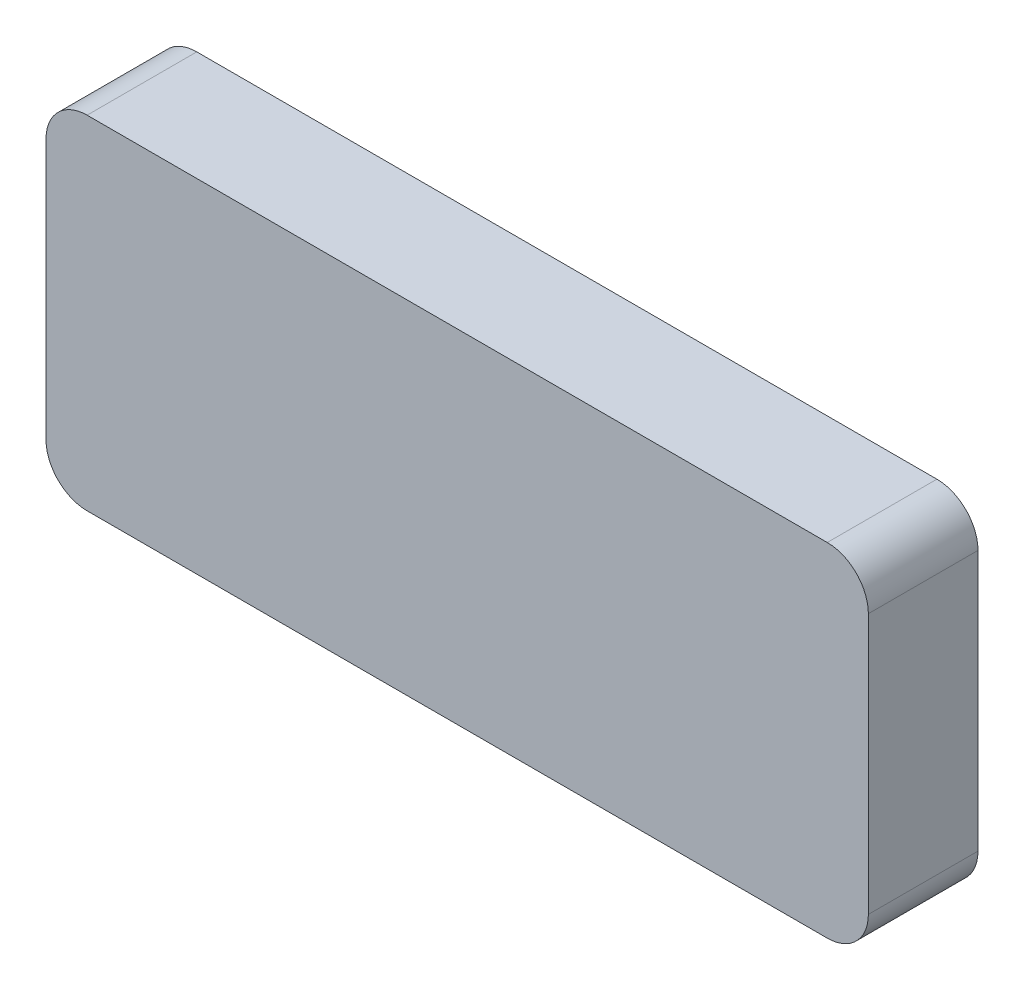
ISO-10303-21;
HEADER;
FILE_DESCRIPTION(('STEP AP214'),'2;1');
FILE_NAME('part.step','',(''),(''),'','','');
FILE_SCHEMA(('AUTOMOTIVE_DESIGN { 1 0 10303 214 1 1 1 1 }'));
ENDSEC;
DATA;
#1=APPLICATION_CONTEXT('core data for automotive mechanical design processes');
#2=APPLICATION_PROTOCOL_DEFINITION('international standard','automotive_design',2000,#1);
#3=PRODUCT_CONTEXT('',#1,'mechanical');
#4=PRODUCT('Part','Part','',(#3));
#5=PRODUCT_RELATED_PRODUCT_CATEGORY('part','',(#4));
#6=PRODUCT_DEFINITION_FORMATION('','',#4);
#7=PRODUCT_DEFINITION_CONTEXT('part definition',#1,'design');
#8=PRODUCT_DEFINITION('design','',#6,#7);
#9=PRODUCT_DEFINITION_SHAPE('','',#8);
#10=(LENGTH_UNIT() NAMED_UNIT(*) SI_UNIT(.MILLI.,.METRE.));
#11=(NAMED_UNIT(*) PLANE_ANGLE_UNIT() SI_UNIT($,.RADIAN.));
#12=(NAMED_UNIT(*) SI_UNIT($,.STERADIAN.) SOLID_ANGLE_UNIT());
#13=UNCERTAINTY_MEASURE_WITH_UNIT(LENGTH_MEASURE(1.E-05),#10,'distance_accuracy_value','');
#14=(GEOMETRIC_REPRESENTATION_CONTEXT(3) GLOBAL_UNCERTAINTY_ASSIGNED_CONTEXT((#13)) GLOBAL_UNIT_ASSIGNED_CONTEXT((#10,
#11,#12)) REPRESENTATION_CONTEXT('',''));
#15=CARTESIAN_POINT('',(0.,0.,0.));
#16=DIRECTION('',(0.,0.,1.));
#17=DIRECTION('',(1.,0.,0.));
#18=AXIS2_PLACEMENT_3D('',#15,#16,#17);
#19=CARTESIAN_POINT('',(30.,12.5,-8.));
#20=DIRECTION('',(1.,0.,0.));
#21=DIRECTION('',(0.,0.,-1.));
#22=AXIS2_PLACEMENT_3D('',#19,#20,#21);
#23=PLANE('',#22);
#24=DIRECTION('',(0.,1.,0.));
#25=VECTOR('',#24,1.);
#26=CARTESIAN_POINT('',(30.,12.5,-8.));
#27=LINE('',#26,#25);
#28=CARTESIAN_POINT('',(30.,-9.5,-8.));
#29=VERTEX_POINT('',#28);
#30=CARTESIAN_POINT('',(30.,9.5,-8.));
#31=VERTEX_POINT('',#30);
#32=EDGE_CURVE('E166',#29,#31,#27,.T.);
#33=ORIENTED_EDGE('',*,*,#32,.T.);
#34=DIRECTION('',(0.,0.,1.));
#35=VECTOR('',#34,1.);
#36=CARTESIAN_POINT('',(30.,9.5,-8.));
#37=LINE('',#36,#35);
#38=CARTESIAN_POINT('',(30.,9.5,0.));
#39=VERTEX_POINT('',#38);
#40=EDGE_CURVE('E121',#31,#39,#37,.T.);
#41=ORIENTED_EDGE('',*,*,#40,.T.);
#42=DIRECTION('',(0.,1.,0.));
#43=VECTOR('',#42,1.);
#44=CARTESIAN_POINT('',(30.,12.5,0.));
#45=LINE('',#44,#43);
#46=CARTESIAN_POINT('',(30.,-9.5,0.));
#47=VERTEX_POINT('',#46);
#48=EDGE_CURVE('E105',#47,#39,#45,.T.);
#49=ORIENTED_EDGE('',*,*,#48,.F.);
#50=DIRECTION('',(0.,0.,1.));
#51=VECTOR('',#50,1.);
#52=CARTESIAN_POINT('',(30.,-9.5,-8.));
#53=LINE('',#52,#51);
#54=EDGE_CURVE('E118',#47,#29,#53,.F.);
#55=ORIENTED_EDGE('',*,*,#54,.T.);
#56=EDGE_LOOP('',(#33,#41,#49,#55));
#57=FACE_BOUND('',#56,.T.);
#58=ADVANCED_FACE('F36',(#57),#23,.T.);
#59=CARTESIAN_POINT('',(-30.,-12.5,-8.));
#60=DIRECTION('',(0.,-1.,0.));
#61=DIRECTION('',(0.,0.,-1.));
#62=AXIS2_PLACEMENT_3D('',#59,#60,#61);
#63=PLANE('',#62);
#64=DIRECTION('',(1.,0.,0.));
#65=VECTOR('',#64,1.);
#66=CARTESIAN_POINT('',(-30.,-12.5,-8.));
#67=LINE('',#66,#65);
#68=CARTESIAN_POINT('',(-27.,-12.5,-8.));
#69=VERTEX_POINT('',#68);
#70=CARTESIAN_POINT('',(27.,-12.5,-8.));
#71=VERTEX_POINT('',#70);
#72=EDGE_CURVE('E127',#69,#71,#67,.T.);
#73=ORIENTED_EDGE('',*,*,#72,.T.);
#74=DIRECTION('',(0.,0.,1.));
#75=VECTOR('',#74,1.);
#76=CARTESIAN_POINT('',(27.,-12.5,-8.));
#77=LINE('',#76,#75);
#78=CARTESIAN_POINT('',(27.,-12.5,0.));
#79=VERTEX_POINT('',#78);
#80=EDGE_CURVE('E153',#71,#79,#77,.T.);
#81=ORIENTED_EDGE('',*,*,#80,.T.);
#82=DIRECTION('',(1.,0.,0.));
#83=VECTOR('',#82,1.);
#84=CARTESIAN_POINT('',(-30.,-12.5,0.));
#85=LINE('',#84,#83);
#86=CARTESIAN_POINT('',(-27.,-12.5,0.));
#87=VERTEX_POINT('',#86);
#88=EDGE_CURVE('E107',#87,#79,#85,.T.);
#89=ORIENTED_EDGE('',*,*,#88,.F.);
#90=DIRECTION('',(0.,0.,1.));
#91=VECTOR('',#90,1.);
#92=CARTESIAN_POINT('',(-27.,-12.5,-8.));
#93=LINE('',#92,#91);
#94=EDGE_CURVE('E151',#87,#69,#93,.F.);
#95=ORIENTED_EDGE('',*,*,#94,.T.);
#96=EDGE_LOOP('',(#73,#81,#89,#95));
#97=FACE_BOUND('',#96,.T.);
#98=ADVANCED_FACE('F155',(#97),#63,.T.);
#99=CARTESIAN_POINT('',(-30.,12.5,-8.));
#100=DIRECTION('',(-1.,0.,0.));
#101=DIRECTION('',(0.,-1.,0.));
#102=AXIS2_PLACEMENT_3D('',#99,#100,#101);
#103=PLANE('',#102);
#104=DIRECTION('',(0.,-1.,0.));
#105=VECTOR('',#104,1.);
#106=CARTESIAN_POINT('',(-30.,12.5,-8.));
#107=LINE('',#106,#105);
#108=CARTESIAN_POINT('',(-30.,9.5,-8.));
#109=VERTEX_POINT('',#108);
#110=CARTESIAN_POINT('',(-30.,-9.5,-8.));
#111=VERTEX_POINT('',#110);
#112=EDGE_CURVE('E132',#109,#111,#107,.T.);
#113=ORIENTED_EDGE('',*,*,#112,.T.);
#114=DIRECTION('',(0.,0.,1.));
#115=VECTOR('',#114,1.);
#116=CARTESIAN_POINT('',(-30.,-9.5,-8.));
#117=LINE('',#116,#115);
#118=CARTESIAN_POINT('',(-30.,-9.5,0.));
#119=VERTEX_POINT('',#118);
#120=EDGE_CURVE('E11',#111,#119,#117,.T.);
#121=ORIENTED_EDGE('',*,*,#120,.T.);
#122=DIRECTION('',(0.,-1.,0.));
#123=VECTOR('',#122,1.);
#124=CARTESIAN_POINT('',(-30.,12.5,0.));
#125=LINE('',#124,#123);
#126=CARTESIAN_POINT('',(-30.,9.5,0.));
#127=VERTEX_POINT('',#126);
#128=EDGE_CURVE('E164',#127,#119,#125,.T.);
#129=ORIENTED_EDGE('',*,*,#128,.F.);
#130=DIRECTION('',(0.,0.,1.));
#131=VECTOR('',#130,1.);
#132=CARTESIAN_POINT('',(-30.,9.5,-8.));
#133=LINE('',#132,#131);
#134=EDGE_CURVE('E44',#127,#109,#133,.F.);
#135=ORIENTED_EDGE('',*,*,#134,.T.);
#136=EDGE_LOOP('',(#113,#121,#129,#135));
#137=FACE_BOUND('',#136,.T.);
#138=ADVANCED_FACE('F163',(#137),#103,.T.);
#139=CARTESIAN_POINT('',(-30.,12.5,-8.));
#140=DIRECTION('',(0.,1.,0.));
#141=DIRECTION('',(0.,0.,1.));
#142=AXIS2_PLACEMENT_3D('',#139,#140,#141);
#143=PLANE('',#142);
#144=DIRECTION('',(-1.,0.,0.));
#145=VECTOR('',#144,1.);
#146=CARTESIAN_POINT('',(-30.,12.5,0.));
#147=LINE('',#146,#145);
#148=CARTESIAN_POINT('',(27.,12.5,0.));
#149=VERTEX_POINT('',#148);
#150=CARTESIAN_POINT('',(-27.,12.5,0.));
#151=VERTEX_POINT('',#150);
#152=EDGE_CURVE('E122',#149,#151,#147,.T.);
#153=ORIENTED_EDGE('',*,*,#152,.F.);
#154=DIRECTION('',(0.,0.,1.));
#155=VECTOR('',#154,1.);
#156=CARTESIAN_POINT('',(27.,12.5,-8.));
#157=LINE('',#156,#155);
#158=CARTESIAN_POINT('',(27.,12.5,-8.));
#159=VERTEX_POINT('',#158);
#160=EDGE_CURVE('E143',#149,#159,#157,.F.);
#161=ORIENTED_EDGE('',*,*,#160,.T.);
#162=DIRECTION('',(-1.,0.,0.));
#163=VECTOR('',#162,1.);
#164=CARTESIAN_POINT('',(-30.,12.5,-8.));
#165=LINE('',#164,#163);
#166=CARTESIAN_POINT('',(-27.,12.5,-8.));
#167=VERTEX_POINT('',#166);
#168=EDGE_CURVE('E170',#159,#167,#165,.T.);
#169=ORIENTED_EDGE('',*,*,#168,.T.);
#170=DIRECTION('',(0.,0.,1.));
#171=VECTOR('',#170,1.);
#172=CARTESIAN_POINT('',(-27.,12.5,-8.));
#173=LINE('',#172,#171);
#174=EDGE_CURVE('E140',#167,#151,#173,.T.);
#175=ORIENTED_EDGE('',*,*,#174,.T.);
#176=EDGE_LOOP('',(#153,#161,#169,#175));
#177=FACE_BOUND('',#176,.T.);
#178=ADVANCED_FACE('F179',(#177),#143,.T.);
#179=CARTESIAN_POINT('',(0.,0.,-8.));
#180=DIRECTION('',(0.,0.,1.));
#181=DIRECTION('',(1.,0.,0.));
#182=AXIS2_PLACEMENT_3D('',#179,#180,#181);
#183=PLANE('',#182);
#184=ORIENTED_EDGE('',*,*,#168,.F.);
#185=CARTESIAN_POINT('',(27.,9.5,-8.));
#186=DIRECTION('',(0.,0.,1.));
#187=DIRECTION('',(1.,0.,0.));
#188=AXIS2_PLACEMENT_3D('',#185,#186,#187);
#189=CIRCLE('',#188,3.);
#190=EDGE_CURVE('E149',#159,#31,#189,.F.);
#191=ORIENTED_EDGE('',*,*,#190,.T.);
#192=ORIENTED_EDGE('',*,*,#32,.F.);
#193=CARTESIAN_POINT('',(27.,-9.5,-8.));
#194=DIRECTION('',(0.,0.,1.));
#195=DIRECTION('',(1.,0.,0.));
#196=AXIS2_PLACEMENT_3D('',#193,#194,#195);
#197=CIRCLE('',#196,3.);
#198=EDGE_CURVE('E126',#29,#71,#197,.F.);
#199=ORIENTED_EDGE('',*,*,#198,.T.);
#200=ORIENTED_EDGE('',*,*,#72,.F.);
#201=CARTESIAN_POINT('',(-27.,-9.5,-8.));
#202=DIRECTION('',(0.,0.,1.));
#203=DIRECTION('',(1.,0.,0.));
#204=AXIS2_PLACEMENT_3D('',#201,#202,#203);
#205=CIRCLE('',#204,3.);
#206=EDGE_CURVE('E51',#69,#111,#205,.F.);
#207=ORIENTED_EDGE('',*,*,#206,.T.);
#208=ORIENTED_EDGE('',*,*,#112,.F.);
#209=CARTESIAN_POINT('',(-27.,9.5,-8.));
#210=DIRECTION('',(0.,0.,1.));
#211=DIRECTION('',(1.,0.,0.));
#212=AXIS2_PLACEMENT_3D('',#209,#210,#211);
#213=CIRCLE('',#212,3.);
#214=EDGE_CURVE('E145',#109,#167,#213,.F.);
#215=ORIENTED_EDGE('',*,*,#214,.T.);
#216=EDGE_LOOP('',(#184,#191,#192,#199,#200,#207,#208,#215));
#217=FACE_BOUND('',#216,.T.);
#218=ADVANCED_FACE('F158',(#217),#183,.F.);
#219=CARTESIAN_POINT('',(0.,0.,0.));
#220=DIRECTION('',(0.,0.,1.));
#221=DIRECTION('',(1.,0.,0.));
#222=AXIS2_PLACEMENT_3D('',#219,#220,#221);
#223=PLANE('',#222);
#224=ORIENTED_EDGE('',*,*,#48,.T.);
#225=CARTESIAN_POINT('',(27.,9.5,0.));
#226=DIRECTION('',(0.,0.,1.));
#227=DIRECTION('',(1.,0.,0.));
#228=AXIS2_PLACEMENT_3D('',#225,#226,#227);
#229=CIRCLE('',#228,3.);
#230=EDGE_CURVE('E112',#39,#149,#229,.T.);
#231=ORIENTED_EDGE('',*,*,#230,.T.);
#232=ORIENTED_EDGE('',*,*,#152,.T.);
#233=CARTESIAN_POINT('',(-27.,9.5,0.));
#234=DIRECTION('',(0.,0.,1.));
#235=DIRECTION('',(1.,0.,0.));
#236=AXIS2_PLACEMENT_3D('',#233,#234,#235);
#237=CIRCLE('',#236,3.);
#238=EDGE_CURVE('E129',#151,#127,#237,.T.);
#239=ORIENTED_EDGE('',*,*,#238,.T.);
#240=ORIENTED_EDGE('',*,*,#128,.T.);
#241=CARTESIAN_POINT('',(-27.,-9.5,0.));
#242=DIRECTION('',(0.,0.,1.));
#243=DIRECTION('',(1.,0.,0.));
#244=AXIS2_PLACEMENT_3D('',#241,#242,#243);
#245=CIRCLE('',#244,3.);
#246=EDGE_CURVE('E113',#119,#87,#245,.T.);
#247=ORIENTED_EDGE('',*,*,#246,.T.);
#248=ORIENTED_EDGE('',*,*,#88,.T.);
#249=CARTESIAN_POINT('',(27.,-9.5,0.));
#250=DIRECTION('',(0.,0.,1.));
#251=DIRECTION('',(1.,0.,0.));
#252=AXIS2_PLACEMENT_3D('',#249,#250,#251);
#253=CIRCLE('',#252,3.);
#254=EDGE_CURVE('E102',#79,#47,#253,.T.);
#255=ORIENTED_EDGE('',*,*,#254,.T.);
#256=EDGE_LOOP('',(#224,#231,#232,#239,#240,#247,#248,#255));
#257=FACE_BOUND('',#256,.T.);
#258=ADVANCED_FACE('F104',(#257),#223,.T.);
#259=CARTESIAN_POINT('',(27.,9.5,-8.));
#260=DIRECTION('',(0.,0.,1.));
#261=DIRECTION('',(1.,0.,0.));
#262=AXIS2_PLACEMENT_3D('',#259,#260,#261);
#263=CYLINDRICAL_SURFACE('',#262,3.);
#264=ORIENTED_EDGE('',*,*,#190,.F.);
#265=ORIENTED_EDGE('',*,*,#160,.F.);
#266=ORIENTED_EDGE('',*,*,#230,.F.);
#267=ORIENTED_EDGE('',*,*,#40,.F.);
#268=EDGE_LOOP('',(#264,#265,#266,#267));
#269=FACE_BOUND('',#268,.T.);
#270=ADVANCED_FACE('F175',(#269),#263,.T.);
#271=CARTESIAN_POINT('',(27.,-9.5,-8.));
#272=DIRECTION('',(0.,0.,1.));
#273=DIRECTION('',(1.,0.,0.));
#274=AXIS2_PLACEMENT_3D('',#271,#272,#273);
#275=CYLINDRICAL_SURFACE('',#274,3.);
#276=ORIENTED_EDGE('',*,*,#198,.F.);
#277=ORIENTED_EDGE('',*,*,#54,.F.);
#278=ORIENTED_EDGE('',*,*,#254,.F.);
#279=ORIENTED_EDGE('',*,*,#80,.F.);
#280=EDGE_LOOP('',(#276,#277,#278,#279));
#281=FACE_BOUND('',#280,.T.);
#282=ADVANCED_FACE('F125',(#281),#275,.T.);
#283=CARTESIAN_POINT('',(-27.,-9.5,-8.));
#284=DIRECTION('',(0.,0.,1.));
#285=DIRECTION('',(1.,0.,0.));
#286=AXIS2_PLACEMENT_3D('',#283,#284,#285);
#287=CYLINDRICAL_SURFACE('',#286,3.);
#288=ORIENTED_EDGE('',*,*,#206,.F.);
#289=ORIENTED_EDGE('',*,*,#94,.F.);
#290=ORIENTED_EDGE('',*,*,#246,.F.);
#291=ORIENTED_EDGE('',*,*,#120,.F.);
#292=EDGE_LOOP('',(#288,#289,#290,#291));
#293=FACE_BOUND('',#292,.T.);
#294=ADVANCED_FACE('F161',(#293),#287,.T.);
#295=CARTESIAN_POINT('',(-27.,9.5,-8.));
#296=DIRECTION('',(0.,0.,1.));
#297=DIRECTION('',(1.,0.,0.));
#298=AXIS2_PLACEMENT_3D('',#295,#296,#297);
#299=CYLINDRICAL_SURFACE('',#298,3.);
#300=ORIENTED_EDGE('',*,*,#214,.F.);
#301=ORIENTED_EDGE('',*,*,#134,.F.);
#302=ORIENTED_EDGE('',*,*,#238,.F.);
#303=ORIENTED_EDGE('',*,*,#174,.F.);
#304=EDGE_LOOP('',(#300,#301,#302,#303));
#305=FACE_BOUND('',#304,.T.);
#306=ADVANCED_FACE('F38',(#305),#299,.T.);
#307=CLOSED_SHELL('',(#58,#98,#138,#178,#218,#258,#270,#282,#294,#306));
#308=MANIFOLD_SOLID_BREP('B2',#307);
#309=ADVANCED_BREP_SHAPE_REPRESENTATION('',(#18,#308),#14);
#310=SHAPE_DEFINITION_REPRESENTATION(#9,#309);
ENDSEC;
END-ISO-10303-21;
